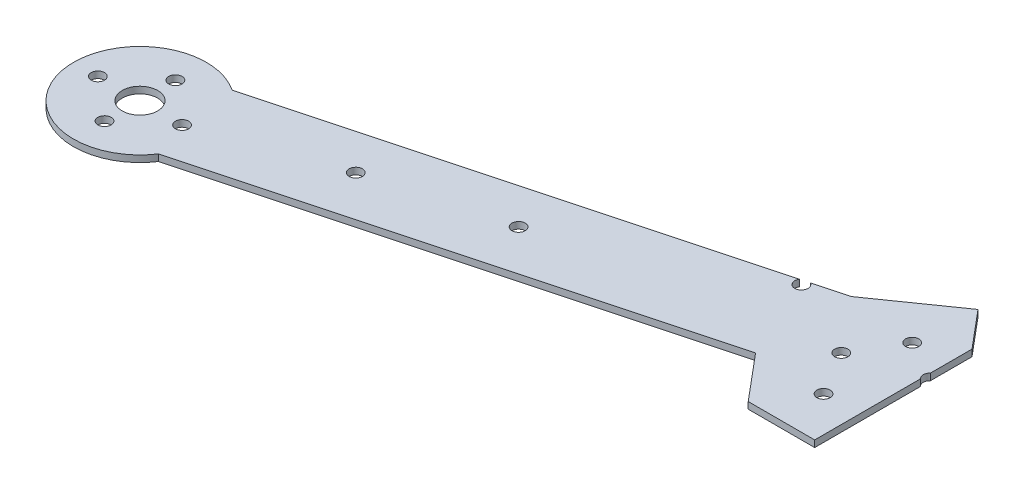
ISO-10303-21;
HEADER;
FILE_DESCRIPTION(('STEP AP214'),'2;1');
FILE_NAME('part.step','',(''),(''),'','','');
FILE_SCHEMA(('AUTOMOTIVE_DESIGN { 1 0 10303 214 1 1 1 1 }'));
ENDSEC;
DATA;
#1=APPLICATION_CONTEXT('core data for automotive mechanical design processes');
#2=APPLICATION_PROTOCOL_DEFINITION('international standard','automotive_design',2000,#1);
#3=PRODUCT_CONTEXT('',#1,'mechanical');
#4=PRODUCT('Part','Part','',(#3));
#5=PRODUCT_RELATED_PRODUCT_CATEGORY('part','',(#4));
#6=PRODUCT_DEFINITION_FORMATION('','',#4);
#7=PRODUCT_DEFINITION_CONTEXT('part definition',#1,'design');
#8=PRODUCT_DEFINITION('design','',#6,#7);
#9=PRODUCT_DEFINITION_SHAPE('','',#8);
#10=(LENGTH_UNIT() NAMED_UNIT(*) SI_UNIT(.MILLI.,.METRE.));
#11=(NAMED_UNIT(*) PLANE_ANGLE_UNIT() SI_UNIT($,.RADIAN.));
#12=(NAMED_UNIT(*) SI_UNIT($,.STERADIAN.) SOLID_ANGLE_UNIT());
#13=UNCERTAINTY_MEASURE_WITH_UNIT(LENGTH_MEASURE(1.E-05),#10,'distance_accuracy_value','');
#14=(GEOMETRIC_REPRESENTATION_CONTEXT(3) GLOBAL_UNCERTAINTY_ASSIGNED_CONTEXT((#13)) GLOBAL_UNIT_ASSIGNED_CONTEXT((#10,
#11,#12)) REPRESENTATION_CONTEXT('',''));
#15=CARTESIAN_POINT('',(0.,0.,0.));
#16=DIRECTION('',(0.,0.,1.));
#17=DIRECTION('',(1.,0.,0.));
#18=AXIS2_PLACEMENT_3D('',#15,#16,#17);
#19=CARTESIAN_POINT('',(8.04869789920337,1.5,30.0437649531862));
#20=DIRECTION('',(0.258773909128812,0.,0.965937919306512));
#21=DIRECTION('',(0.965937919306512,0.,-0.258773909128812));
#22=AXIS2_PLACEMENT_3D('',#19,#20,#21);
#23=PLANE('',#22);
#24=DIRECTION('',(-0.965937919306512,0.,0.258773909128812));
#25=VECTOR('',#24,1.);
#26=CARTESIAN_POINT('',(8.04869789920337,0.,30.0437649531862));
#27=LINE('',#26,#25);
#28=CARTESIAN_POINT('',(-23.8632806144762,0.,38.5929556029831));
#29=VERTEX_POINT('',#28);
#30=CARTESIAN_POINT('',(-31.1943125351646,0.,40.5569325316729));
#31=VERTEX_POINT('',#30);
#32=EDGE_CURVE('E215',#29,#31,#27,.T.);
#33=ORIENTED_EDGE('',*,*,#32,.T.);
#34=DIRECTION('',(0.,1.,0.));
#35=VECTOR('',#34,1.);
#36=CARTESIAN_POINT('',(-31.1943125351646,-4.24264068711929,40.5569325316729));
#37=LINE('',#36,#35);
#38=CARTESIAN_POINT('',(-31.1943125351646,1.5,40.5569325316729));
#39=VERTEX_POINT('',#38);
#40=EDGE_CURVE('E59',#31,#39,#37,.T.);
#41=ORIENTED_EDGE('',*,*,#40,.T.);
#42=DIRECTION('',(-0.965937919306512,0.,0.258773909128812));
#43=VECTOR('',#42,1.);
#44=CARTESIAN_POINT('',(8.04869789920337,1.5,30.0437649531862));
#45=LINE('',#44,#43);
#46=CARTESIAN_POINT('',(-23.8632806144762,1.5,38.5929556029831));
#47=VERTEX_POINT('',#46);
#48=EDGE_CURVE('E310',#47,#39,#45,.T.);
#49=ORIENTED_EDGE('',*,*,#48,.F.);
#50=DIRECTION('',(0.,-1.,0.));
#51=VECTOR('',#50,1.);
#52=CARTESIAN_POINT('',(-23.8632806144762,1.5,38.5929556029831));
#53=LINE('',#52,#51);
#54=EDGE_CURVE('E266',#47,#29,#53,.T.);
#55=ORIENTED_EDGE('',*,*,#54,.T.);
#56=EDGE_LOOP('',(#33,#41,#49,#55));
#57=FACE_BOUND('',#56,.T.);
#58=ADVANCED_FACE('F43',(#57),#23,.F.);
#59=CARTESIAN_POINT('',(0.999999999999998,1.5,45.7611275320955));
#60=DIRECTION('',(0.,-1.,0.));
#61=DIRECTION('',(0.,0.,-1.));
#62=AXIS2_PLACEMENT_3D('',#59,#60,#61);
#63=CYLINDRICAL_SURFACE('',#62,1.5);
#64=CARTESIAN_POINT('',(0.999999999999998,0.,45.7611275320955));
#65=DIRECTION('',(0.,1.,0.));
#66=DIRECTION('',(0.,0.,1.));
#67=AXIS2_PLACEMENT_3D('',#64,#65,#66);
#68=CIRCLE('',#67,1.5);
#69=CARTESIAN_POINT('',(0.,0.,44.6430935433456));
#70=VERTEX_POINT('',#69);
#71=CARTESIAN_POINT('',(0.,0.,46.8791615208454));
#72=VERTEX_POINT('',#71);
#73=EDGE_CURVE('E199',#70,#72,#68,.T.);
#74=ORIENTED_EDGE('',*,*,#73,.F.);
#75=DIRECTION('',(0.,-1.,0.));
#76=VECTOR('',#75,1.);
#77=CARTESIAN_POINT('',(0.,1.5,44.6430935433456));
#78=LINE('',#77,#76);
#79=CARTESIAN_POINT('',(0.,1.5,44.6430935433456));
#80=VERTEX_POINT('',#79);
#81=EDGE_CURVE('E52',#80,#70,#78,.T.);
#82=ORIENTED_EDGE('',*,*,#81,.F.);
#83=CARTESIAN_POINT('',(0.999999999999998,1.5,45.7611275320955));
#84=DIRECTION('',(0.,1.,0.));
#85=DIRECTION('',(0.,0.,1.));
#86=AXIS2_PLACEMENT_3D('',#83,#84,#85);
#87=CIRCLE('',#86,1.5);
#88=CARTESIAN_POINT('',(0.,1.5,46.8791615208454));
#89=VERTEX_POINT('',#88);
#90=EDGE_CURVE('E299',#80,#89,#87,.T.);
#91=ORIENTED_EDGE('',*,*,#90,.T.);
#92=DIRECTION('',(0.,-1.,0.));
#93=VECTOR('',#92,1.);
#94=CARTESIAN_POINT('',(0.,1.5,46.8791615208454));
#95=LINE('',#94,#93);
#96=EDGE_CURVE('E67',#89,#72,#95,.T.);
#97=ORIENTED_EDGE('',*,*,#96,.T.);
#98=EDGE_LOOP('',(#74,#82,#91,#97));
#99=FACE_BOUND('',#98,.T.);
#100=ADVANCED_FACE('F283',(#99),#63,.F.);
#101=CARTESIAN_POINT('',(0.,1.5,0.));
#102=DIRECTION('',(1.,0.,0.));
#103=DIRECTION('',(0.,0.,-1.));
#104=AXIS2_PLACEMENT_3D('',#101,#102,#103);
#105=PLANE('',#104);
#106=DIRECTION('',(0.,0.,1.));
#107=VECTOR('',#106,1.);
#108=CARTESIAN_POINT('',(0.,0.,0.));
#109=LINE('',#108,#107);
#110=CARTESIAN_POINT('',(0.,0.,35.2611275320955));
#111=VERTEX_POINT('',#110);
#112=EDGE_CURVE('E202',#111,#70,#109,.T.);
#113=ORIENTED_EDGE('',*,*,#112,.F.);
#114=DIRECTION('',(0.,-1.,0.));
#115=VECTOR('',#114,1.);
#116=CARTESIAN_POINT('',(0.,1.5,35.2611275320955));
#117=LINE('',#116,#115);
#118=CARTESIAN_POINT('',(0.,1.5,35.2611275320955));
#119=VERTEX_POINT('',#118);
#120=EDGE_CURVE('E274',#119,#111,#117,.T.);
#121=ORIENTED_EDGE('',*,*,#120,.F.);
#122=DIRECTION('',(0.,0.,1.));
#123=VECTOR('',#122,1.);
#124=CARTESIAN_POINT('',(0.,1.5,0.));
#125=LINE('',#124,#123);
#126=EDGE_CURVE('E282',#119,#80,#125,.T.);
#127=ORIENTED_EDGE('',*,*,#126,.T.);
#128=ORIENTED_EDGE('',*,*,#81,.T.);
#129=EDGE_LOOP('',(#113,#121,#127,#128));
#130=FACE_BOUND('',#129,.T.);
#131=ADVANCED_FACE('F280',(#130),#105,.T.);
#132=CARTESIAN_POINT('',(-17.3627158867799,1.5,14.5690484968327));
#133=DIRECTION('',(-0.766044443118982,0.,0.642787609686535));
#134=DIRECTION('',(0.642787609686535,0.,0.766044443118982));
#135=AXIS2_PLACEMENT_3D('',#132,#133,#134);
#136=PLANE('',#135);
#137=DIRECTION('',(-0.642787609686535,0.,-0.766044443118982));
#138=VECTOR('',#137,1.);
#139=CARTESIAN_POINT('',(-17.3627158867799,0.,14.5690484968327));
#140=LINE('',#139,#138);
#141=CARTESIAN_POINT('',(-7.07066370655188,0.,26.8346386577867));
#142=VERTEX_POINT('',#141);
#143=EDGE_CURVE('E206',#111,#142,#140,.T.);
#144=ORIENTED_EDGE('',*,*,#143,.T.);
#145=DIRECTION('',(0.,-1.,0.));
#146=VECTOR('',#145,1.);
#147=CARTESIAN_POINT('',(-7.07066370655188,1.5,26.8346386577867));
#148=LINE('',#147,#146);
#149=CARTESIAN_POINT('',(-7.07066370655188,1.5,26.8346386577867));
#150=VERTEX_POINT('',#149);
#151=EDGE_CURVE('E270',#150,#142,#148,.T.);
#152=ORIENTED_EDGE('',*,*,#151,.F.);
#153=DIRECTION('',(-0.642787609686535,0.,-0.766044443118982));
#154=VECTOR('',#153,1.);
#155=CARTESIAN_POINT('',(-17.3627158867799,1.5,14.5690484968327));
#156=LINE('',#155,#154);
#157=EDGE_CURVE('E294',#119,#150,#156,.T.);
#158=ORIENTED_EDGE('',*,*,#157,.F.);
#159=ORIENTED_EDGE('',*,*,#120,.T.);
#160=EDGE_LOOP('',(#144,#152,#158,#159));
#161=FACE_BOUND('',#160,.T.);
#162=ADVANCED_FACE('F291',(#161),#136,.F.);
#163=CARTESIAN_POINT('',(10.2819788179745,1.5,14.684187554255));
#164=DIRECTION('',(0.573576436351045,0.,0.819152044288993));
#165=DIRECTION('',(0.819152044288993,0.,-0.573576436351045));
#166=AXIS2_PLACEMENT_3D('',#163,#164,#165);
#167=PLANE('',#166);
#168=DIRECTION('',(-0.819152044288993,0.,0.573576436351045));
#169=VECTOR('',#168,1.);
#170=CARTESIAN_POINT('',(10.2819788179745,0.,14.684187554255));
#171=LINE('',#170,#169);
#172=EDGE_CURVE('E210',#142,#29,#171,.T.);
#173=ORIENTED_EDGE('',*,*,#172,.T.);
#174=ORIENTED_EDGE('',*,*,#54,.F.);
#175=DIRECTION('',(-0.819152044288993,0.,0.573576436351045));
#176=VECTOR('',#175,1.);
#177=CARTESIAN_POINT('',(10.2819788179745,1.5,14.684187554255));
#178=LINE('',#177,#176);
#179=EDGE_CURVE('E297',#150,#47,#178,.T.);
#180=ORIENTED_EDGE('',*,*,#179,.F.);
#181=ORIENTED_EDGE('',*,*,#151,.T.);
#182=EDGE_LOOP('',(#173,#174,#180,#181));
#183=FACE_BOUND('',#182,.T.);
#184=ADVANCED_FACE('F350',(#183),#167,.F.);
#185=CARTESIAN_POINT('',(-33.1085220639019,1.5,41.0697475612336));
#186=VERTEX_POINT('',#185);
#187=CARTESIAN_POINT('',(-134.097880355283,1.5,68.1247067911532));
#188=VERTEX_POINT('',#187);
#189=EDGE_CURVE('E309',#186,#188,#45,.T.);
#190=ORIENTED_EDGE('',*,*,#189,.F.);
#191=DIRECTION('',(0.,1.,0.));
#192=VECTOR('',#191,1.);
#193=CARTESIAN_POINT('',(-33.1085220639019,-4.24264068711929,41.0697475612336));
#194=LINE('',#193,#192);
#195=CARTESIAN_POINT('',(-33.1085220639019,0.,41.0697475612336));
#196=VERTEX_POINT('',#195);
#197=EDGE_CURVE('E363',#186,#196,#194,.F.);
#198=ORIENTED_EDGE('',*,*,#197,.T.);
#199=CARTESIAN_POINT('',(-134.097880355283,0.,68.1247067911532));
#200=VERTEX_POINT('',#199);
#201=EDGE_CURVE('E214',#196,#200,#27,.T.);
#202=ORIENTED_EDGE('',*,*,#201,.T.);
#203=DIRECTION('',(0.,-1.,0.));
#204=VECTOR('',#203,1.);
#205=CARTESIAN_POINT('',(-134.097880355283,1.5,68.1247067911532));
#206=LINE('',#205,#204);
#207=EDGE_CURVE('E262',#188,#200,#206,.T.);
#208=ORIENTED_EDGE('',*,*,#207,.F.);
#209=EDGE_LOOP('',(#190,#198,#202,#208));
#210=FACE_BOUND('',#209,.T.);
#211=ADVANCED_FACE('F341',(#210),#23,.F.);
#212=CARTESIAN_POINT('',(-142.429473622566,1.5,80.5980605353781));
#213=DIRECTION('',(0.,-1.,0.));
#214=DIRECTION('',(0.,0.,-1.));
#215=AXIS2_PLACEMENT_3D('',#212,#213,#214);
#216=CYLINDRICAL_SURFACE('',#215,15.);
#217=CARTESIAN_POINT('',(-142.429473622566,0.,80.5980605353781));
#218=DIRECTION('',(0.,1.,0.));
#219=DIRECTION('',(0.,0.,1.));
#220=AXIS2_PLACEMENT_3D('',#217,#218,#219);
#221=CIRCLE('',#220,15.);
#222=CARTESIAN_POINT('',(-129.929473622566,0.,88.8896225112666));
#223=VERTEX_POINT('',#222);
#224=EDGE_CURVE('E219',#200,#223,#221,.T.);
#225=ORIENTED_EDGE('',*,*,#224,.T.);
#226=DIRECTION('',(0.,-1.,0.));
#227=VECTOR('',#226,1.);
#228=CARTESIAN_POINT('',(-129.929473622566,1.5,88.8896225112666));
#229=LINE('',#228,#227);
#230=CARTESIAN_POINT('',(-129.929473622566,1.5,88.8896225112666));
#231=VERTEX_POINT('',#230);
#232=EDGE_CURVE('E259',#231,#223,#229,.T.);
#233=ORIENTED_EDGE('',*,*,#232,.F.);
#234=CARTESIAN_POINT('',(-142.429473622566,1.5,80.5980605353781));
#235=DIRECTION('',(0.,1.,0.));
#236=DIRECTION('',(0.,0.,1.));
#237=AXIS2_PLACEMENT_3D('',#234,#235,#236);
#238=CIRCLE('',#237,15.);
#239=EDGE_CURVE('E314',#188,#231,#238,.T.);
#240=ORIENTED_EDGE('',*,*,#239,.F.);
#241=ORIENTED_EDGE('',*,*,#207,.T.);
#242=EDGE_LOOP('',(#225,#233,#240,#241));
#243=FACE_BOUND('',#242,.T.);
#244=ADVANCED_FACE('F349',(#243),#216,.T.);
#245=CARTESIAN_POINT('',(13.5187812452748,1.5,50.4527784637748));
#246=DIRECTION('',(0.258819045102521,0.,0.965925826289068));
#247=DIRECTION('',(0.965925826289068,0.,-0.258819045102521));
#248=AXIS2_PLACEMENT_3D('',#245,#246,#247);
#249=PLANE('',#248);
#250=DIRECTION('',(-0.965925826289068,0.,0.258819045102521));
#251=VECTOR('',#250,1.);
#252=CARTESIAN_POINT('',(13.5187812452748,0.,50.4527784637748));
#253=LINE('',#252,#251);
#254=CARTESIAN_POINT('',(-23.6776327307683,0.,60.4195275499893));
#255=VERTEX_POINT('',#254);
#256=EDGE_CURVE('E223',#255,#223,#253,.T.);
#257=ORIENTED_EDGE('',*,*,#256,.F.);
#258=DIRECTION('',(0.,-1.,0.));
#259=VECTOR('',#258,1.);
#260=CARTESIAN_POINT('',(-23.6776327307683,1.5,60.4195275499893));
#261=LINE('',#260,#259);
#262=CARTESIAN_POINT('',(-23.6776327307683,1.5,60.4195275499893));
#263=VERTEX_POINT('',#262);
#264=EDGE_CURVE('E144',#263,#255,#261,.T.);
#265=ORIENTED_EDGE('',*,*,#264,.F.);
#266=DIRECTION('',(-0.965925826289068,0.,0.258819045102521));
#267=VECTOR('',#266,1.);
#268=CARTESIAN_POINT('',(13.5187812452748,1.5,50.4527784637748));
#269=LINE('',#268,#267);
#270=EDGE_CURVE('E156',#263,#231,#269,.T.);
#271=ORIENTED_EDGE('',*,*,#270,.T.);
#272=ORIENTED_EDGE('',*,*,#232,.T.);
#273=EDGE_LOOP('',(#257,#265,#271,#272));
#274=FACE_BOUND('',#273,.T.);
#275=ADVANCED_FACE('F319',(#274),#249,.T.);
#276=CARTESIAN_POINT('',(-43.6454148352486,1.5,36.6228514908364));
#277=DIRECTION('',(-0.766044443118979,0.,0.642787609686538));
#278=DIRECTION('',(0.642787609686538,0.,0.766044443118979));
#279=AXIS2_PLACEMENT_3D('',#276,#277,#278);
#280=PLANE('',#279);
#281=DIRECTION('',(-0.642787609686538,0.,-0.766044443118979));
#282=VECTOR('',#281,1.);
#283=CARTESIAN_POINT('',(-43.6454148352486,0.,36.6228514908364));
#284=LINE('',#283,#282);
#285=CARTESIAN_POINT('',(-15.,0.,70.7611275320955));
#286=VERTEX_POINT('',#285);
#287=EDGE_CURVE('E138',#286,#255,#284,.T.);
#288=ORIENTED_EDGE('',*,*,#287,.F.);
#289=DIRECTION('',(0.,-1.,0.));
#290=VECTOR('',#289,1.);
#291=CARTESIAN_POINT('',(-15.,1.5,70.7611275320955));
#292=LINE('',#291,#290);
#293=CARTESIAN_POINT('',(-15.,1.5,70.7611275320955));
#294=VERTEX_POINT('',#293);
#295=EDGE_CURVE('E133',#294,#286,#292,.T.);
#296=ORIENTED_EDGE('',*,*,#295,.F.);
#297=DIRECTION('',(-0.642787609686538,0.,-0.766044443118979));
#298=VECTOR('',#297,1.);
#299=CARTESIAN_POINT('',(-43.6454148352486,1.5,36.6228514908364));
#300=LINE('',#299,#298);
#301=EDGE_CURVE('E136',#294,#263,#300,.T.);
#302=ORIENTED_EDGE('',*,*,#301,.T.);
#303=ORIENTED_EDGE('',*,*,#264,.T.);
#304=EDGE_LOOP('',(#288,#296,#302,#303));
#305=FACE_BOUND('',#304,.T.);
#306=ADVANCED_FACE('F135',(#305),#280,.T.);
#307=CARTESIAN_POINT('',(0.,1.5,70.7611275320955));
#308=DIRECTION('',(0.,0.,1.));
#309=DIRECTION('',(1.,0.,0.));
#310=AXIS2_PLACEMENT_3D('',#307,#308,#309);
#311=PLANE('',#310);
#312=DIRECTION('',(-1.,0.,0.));
#313=VECTOR('',#312,1.);
#314=CARTESIAN_POINT('',(0.,0.,70.7611275320955));
#315=LINE('',#314,#313);
#316=CARTESIAN_POINT('',(0.,0.,70.7611275320955));
#317=VERTEX_POINT('',#316);
#318=EDGE_CURVE('E229',#317,#286,#315,.T.);
#319=ORIENTED_EDGE('',*,*,#318,.F.);
#320=DIRECTION('',(0.,-1.,0.));
#321=VECTOR('',#320,1.);
#322=CARTESIAN_POINT('',(0.,1.5,70.7611275320955));
#323=LINE('',#322,#321);
#324=CARTESIAN_POINT('',(0.,1.5,70.7611275320955));
#325=VERTEX_POINT('',#324);
#326=EDGE_CURVE('E145',#325,#317,#323,.T.);
#327=ORIENTED_EDGE('',*,*,#326,.F.);
#328=DIRECTION('',(-1.,0.,0.));
#329=VECTOR('',#328,1.);
#330=CARTESIAN_POINT('',(0.,1.5,70.7611275320955));
#331=LINE('',#330,#329);
#332=EDGE_CURVE('E154',#325,#294,#331,.T.);
#333=ORIENTED_EDGE('',*,*,#332,.T.);
#334=ORIENTED_EDGE('',*,*,#295,.T.);
#335=EDGE_LOOP('',(#319,#327,#333,#334));
#336=FACE_BOUND('',#335,.T.);
#337=ADVANCED_FACE('F159',(#336),#311,.T.);
#338=CARTESIAN_POINT('',(-8.,1.5,60.7611275320955));
#339=DIRECTION('',(0.,-1.,0.));
#340=DIRECTION('',(0.,0.,-1.));
#341=AXIS2_PLACEMENT_3D('',#338,#339,#340);
#342=CYLINDRICAL_SURFACE('',#341,1.5);
#343=CARTESIAN_POINT('',(-8.,1.5,60.7611275320955));
#344=DIRECTION('',(0.,1.,0.));
#345=DIRECTION('',(0.,0.,1.));
#346=AXIS2_PLACEMENT_3D('',#343,#344,#345);
#347=CIRCLE('',#346,1.5);
#348=CARTESIAN_POINT('',(-8.,1.5,62.2611275320955));
#349=VERTEX_POINT('',#348);
#350=EDGE_CURVE('E175',#349,#349,#347,.T.);
#351=ORIENTED_EDGE('',*,*,#350,.T.);
#352=EDGE_LOOP('',(#351));
#353=FACE_BOUND('',#352,.T.);
#354=CARTESIAN_POINT('',(-8.,0.,60.7611275320955));
#355=DIRECTION('',(0.,1.,0.));
#356=DIRECTION('',(0.,0.,1.));
#357=AXIS2_PLACEMENT_3D('',#354,#355,#356);
#358=CIRCLE('',#357,1.5);
#359=CARTESIAN_POINT('',(-8.,0.,62.2611275320955));
#360=VERTEX_POINT('',#359);
#361=EDGE_CURVE('E244',#360,#360,#358,.T.);
#362=ORIENTED_EDGE('',*,*,#361,.F.);
#363=EDGE_LOOP('',(#362));
#364=FACE_BOUND('',#363,.T.);
#365=ADVANCED_FACE('F440',(#353,#364),#342,.F.);
#366=CARTESIAN_POINT('',(-14.,1.5,50.7611275320955));
#367=DIRECTION('',(0.,-1.,0.));
#368=DIRECTION('',(0.,0.,-1.));
#369=AXIS2_PLACEMENT_3D('',#366,#367,#368);
#370=CYLINDRICAL_SURFACE('',#369,1.5);
#371=CARTESIAN_POINT('',(-14.,1.5,50.7611275320955));
#372=DIRECTION('',(0.,1.,0.));
#373=DIRECTION('',(0.,0.,1.));
#374=AXIS2_PLACEMENT_3D('',#371,#372,#373);
#375=CIRCLE('',#374,1.5);
#376=CARTESIAN_POINT('',(-14.,1.5,52.2611275320955));
#377=VERTEX_POINT('',#376);
#378=EDGE_CURVE('E171',#377,#377,#375,.T.);
#379=ORIENTED_EDGE('',*,*,#378,.T.);
#380=EDGE_LOOP('',(#379));
#381=FACE_BOUND('',#380,.T.);
#382=CARTESIAN_POINT('',(-14.,0.,50.7611275320955));
#383=DIRECTION('',(0.,1.,0.));
#384=DIRECTION('',(0.,0.,1.));
#385=AXIS2_PLACEMENT_3D('',#382,#383,#384);
#386=CIRCLE('',#385,1.5);
#387=CARTESIAN_POINT('',(-14.,0.,52.2611275320955));
#388=VERTEX_POINT('',#387);
#389=EDGE_CURVE('E240',#388,#388,#386,.T.);
#390=ORIENTED_EDGE('',*,*,#389,.F.);
#391=EDGE_LOOP('',(#390));
#392=FACE_BOUND('',#391,.T.);
#393=ADVANCED_FACE('F334',(#381,#392),#370,.F.);
#394=CARTESIAN_POINT('',(-8.,1.5,40.7611275320955));
#395=DIRECTION('',(0.,-1.,0.));
#396=DIRECTION('',(0.,0.,-1.));
#397=AXIS2_PLACEMENT_3D('',#394,#395,#396);
#398=CYLINDRICAL_SURFACE('',#397,1.5);
#399=CARTESIAN_POINT('',(-8.,1.5,40.7611275320955));
#400=DIRECTION('',(0.,1.,0.));
#401=DIRECTION('',(0.,0.,1.));
#402=AXIS2_PLACEMENT_3D('',#399,#400,#401);
#403=CIRCLE('',#402,1.5);
#404=CARTESIAN_POINT('',(-8.,1.5,42.2611275320955));
#405=VERTEX_POINT('',#404);
#406=EDGE_CURVE('E164',#405,#405,#403,.T.);
#407=ORIENTED_EDGE('',*,*,#406,.T.);
#408=EDGE_LOOP('',(#407));
#409=FACE_BOUND('',#408,.T.);
#410=CARTESIAN_POINT('',(-8.,0.,40.7611275320955));
#411=DIRECTION('',(0.,1.,0.));
#412=DIRECTION('',(0.,0.,1.));
#413=AXIS2_PLACEMENT_3D('',#410,#411,#412);
#414=CIRCLE('',#413,1.5);
#415=CARTESIAN_POINT('',(-8.,0.,42.2611275320955));
#416=VERTEX_POINT('',#415);
#417=EDGE_CURVE('E236',#416,#416,#414,.T.);
#418=ORIENTED_EDGE('',*,*,#417,.F.);
#419=EDGE_LOOP('',(#418));
#420=FACE_BOUND('',#419,.T.);
#421=ADVANCED_FACE('F325',(#409,#420),#398,.F.);
#422=CARTESIAN_POINT('',(0.,1.5,0.));
#423=DIRECTION('',(1.,0.,0.));
#424=DIRECTION('',(0.,0.,-1.));
#425=AXIS2_PLACEMENT_3D('',#422,#423,#424);
#426=PLANE('',#425);
#427=DIRECTION('',(0.,0.,1.));
#428=VECTOR('',#427,1.);
#429=CARTESIAN_POINT('',(0.,0.,0.));
#430=LINE('',#429,#428);
#431=EDGE_CURVE('E232',#72,#317,#430,.T.);
#432=ORIENTED_EDGE('',*,*,#431,.F.);
#433=ORIENTED_EDGE('',*,*,#96,.F.);
#434=DIRECTION('',(0.,0.,1.));
#435=VECTOR('',#434,1.);
#436=CARTESIAN_POINT('',(0.,1.5,0.));
#437=LINE('',#436,#435);
#438=EDGE_CURVE('E161',#89,#325,#437,.T.);
#439=ORIENTED_EDGE('',*,*,#438,.T.);
#440=ORIENTED_EDGE('',*,*,#326,.T.);
#441=EDGE_LOOP('',(#432,#433,#439,#440));
#442=FACE_BOUND('',#441,.T.);
#443=ADVANCED_FACE('F322',(#442),#426,.T.);
#444=CARTESIAN_POINT('',(-142.429473622566,1.5,72.5980605353781));
#445=DIRECTION('',(0.,-1.,0.));
#446=DIRECTION('',(0.,0.,-1.));
#447=AXIS2_PLACEMENT_3D('',#444,#445,#446);
#448=CYLINDRICAL_SURFACE('',#447,1.5);
#449=CARTESIAN_POINT('',(-142.429473622566,1.5,72.5980605353781));
#450=DIRECTION('',(0.,1.,0.));
#451=DIRECTION('',(0.,0.,1.));
#452=AXIS2_PLACEMENT_3D('',#449,#450,#451);
#453=CIRCLE('',#452,1.5);
#454=CARTESIAN_POINT('',(-142.429473622566,1.5,74.0980605353781));
#455=VERTEX_POINT('',#454);
#456=EDGE_CURVE('E303',#455,#455,#453,.T.);
#457=ORIENTED_EDGE('',*,*,#456,.T.);
#458=EDGE_LOOP('',(#457));
#459=FACE_BOUND('',#458,.T.);
#460=CARTESIAN_POINT('',(-142.429473622566,0.,72.5980605353781));
#461=DIRECTION('',(0.,1.,0.));
#462=DIRECTION('',(0.,0.,1.));
#463=AXIS2_PLACEMENT_3D('',#460,#461,#462);
#464=CIRCLE('',#463,1.5);
#465=CARTESIAN_POINT('',(-142.429473622566,0.,74.0980605353781));
#466=VERTEX_POINT('',#465);
#467=EDGE_CURVE('E195',#466,#466,#464,.T.);
#468=ORIENTED_EDGE('',*,*,#467,.F.);
#469=EDGE_LOOP('',(#468));
#470=FACE_BOUND('',#469,.T.);
#471=ADVANCED_FACE('F324',(#459,#470),#448,.F.);
#472=CARTESIAN_POINT('',(-132.929473622566,1.5,80.5980605353781));
#473=DIRECTION('',(0.,-1.,0.));
#474=DIRECTION('',(0.,0.,-1.));
#475=AXIS2_PLACEMENT_3D('',#472,#473,#474);
#476=CYLINDRICAL_SURFACE('',#475,1.5);
#477=CARTESIAN_POINT('',(-132.929473622566,1.5,80.5980605353781));
#478=DIRECTION('',(0.,1.,0.));
#479=DIRECTION('',(0.,0.,1.));
#480=AXIS2_PLACEMENT_3D('',#477,#478,#479);
#481=CIRCLE('',#480,1.5);
#482=CARTESIAN_POINT('',(-132.929473622566,1.5,82.0980605353781));
#483=VERTEX_POINT('',#482);
#484=EDGE_CURVE('E402',#483,#483,#481,.T.);
#485=ORIENTED_EDGE('',*,*,#484,.T.);
#486=EDGE_LOOP('',(#485));
#487=FACE_BOUND('',#486,.T.);
#488=CARTESIAN_POINT('',(-132.929473622566,0.,80.5980605353781));
#489=DIRECTION('',(0.,1.,0.));
#490=DIRECTION('',(0.,0.,1.));
#491=AXIS2_PLACEMENT_3D('',#488,#489,#490);
#492=CIRCLE('',#491,1.5);
#493=CARTESIAN_POINT('',(-132.929473622566,0.,82.0980605353781));
#494=VERTEX_POINT('',#493);
#495=EDGE_CURVE('E191',#494,#494,#492,.T.);
#496=ORIENTED_EDGE('',*,*,#495,.F.);
#497=EDGE_LOOP('',(#496));
#498=FACE_BOUND('',#497,.T.);
#499=ADVANCED_FACE('F331',(#487,#498),#476,.F.);
#500=CARTESIAN_POINT('',(-151.929473622566,1.5,80.5980605353781));
#501=DIRECTION('',(0.,-1.,0.));
#502=DIRECTION('',(0.,0.,-1.));
#503=AXIS2_PLACEMENT_3D('',#500,#501,#502);
#504=CYLINDRICAL_SURFACE('',#503,1.5);
#505=CARTESIAN_POINT('',(-151.929473622566,1.5,80.5980605353781));
#506=DIRECTION('',(0.,1.,0.));
#507=DIRECTION('',(0.,0.,1.));
#508=AXIS2_PLACEMENT_3D('',#505,#506,#507);
#509=CIRCLE('',#508,1.5);
#510=CARTESIAN_POINT('',(-151.929473622566,1.5,82.0980605353781));
#511=VERTEX_POINT('',#510);
#512=EDGE_CURVE('E398',#511,#511,#509,.T.);
#513=ORIENTED_EDGE('',*,*,#512,.T.);
#514=EDGE_LOOP('',(#513));
#515=FACE_BOUND('',#514,.T.);
#516=CARTESIAN_POINT('',(-151.929473622566,0.,80.5980605353781));
#517=DIRECTION('',(0.,1.,0.));
#518=DIRECTION('',(0.,0.,1.));
#519=AXIS2_PLACEMENT_3D('',#516,#517,#518);
#520=CIRCLE('',#519,1.5);
#521=CARTESIAN_POINT('',(-151.929473622566,0.,82.0980605353781));
#522=VERTEX_POINT('',#521);
#523=EDGE_CURVE('E187',#522,#522,#520,.T.);
#524=ORIENTED_EDGE('',*,*,#523,.F.);
#525=EDGE_LOOP('',(#524));
#526=FACE_BOUND('',#525,.T.);
#527=ADVANCED_FACE('F480',(#515,#526),#504,.F.);
#528=CARTESIAN_POINT('',(-142.429473622566,1.5,88.5980605353781));
#529=DIRECTION('',(0.,-1.,0.));
#530=DIRECTION('',(0.,0.,-1.));
#531=AXIS2_PLACEMENT_3D('',#528,#529,#530);
#532=CYLINDRICAL_SURFACE('',#531,1.5);
#533=CARTESIAN_POINT('',(-142.429473622566,1.5,88.5980605353781));
#534=DIRECTION('',(0.,1.,0.));
#535=DIRECTION('',(0.,0.,1.));
#536=AXIS2_PLACEMENT_3D('',#533,#534,#535);
#537=CIRCLE('',#536,1.5);
#538=CARTESIAN_POINT('',(-142.429473622566,1.5,90.0980605353781));
#539=VERTEX_POINT('',#538);
#540=EDGE_CURVE('E252',#539,#539,#537,.T.);
#541=ORIENTED_EDGE('',*,*,#540,.T.);
#542=EDGE_LOOP('',(#541));
#543=FACE_BOUND('',#542,.T.);
#544=CARTESIAN_POINT('',(-142.429473622566,0.,88.5980605353781));
#545=DIRECTION('',(0.,1.,0.));
#546=DIRECTION('',(0.,0.,1.));
#547=AXIS2_PLACEMENT_3D('',#544,#545,#546);
#548=CIRCLE('',#547,1.5);
#549=CARTESIAN_POINT('',(-142.429473622566,0.,90.0980605353781));
#550=VERTEX_POINT('',#549);
#551=EDGE_CURVE('E183',#550,#550,#548,.T.);
#552=ORIENTED_EDGE('',*,*,#551,.F.);
#553=EDGE_LOOP('',(#552));
#554=FACE_BOUND('',#553,.T.);
#555=ADVANCED_FACE('F45',(#543,#554),#532,.F.);
#556=CARTESIAN_POINT('',(-142.429473622566,1.5,80.5980605353781));
#557=DIRECTION('',(0.,-1.,0.));
#558=DIRECTION('',(0.,0.,-1.));
#559=AXIS2_PLACEMENT_3D('',#556,#557,#558);
#560=CYLINDRICAL_SURFACE('',#559,3.99999999999999);
#561=CARTESIAN_POINT('',(-142.429473622566,1.5,80.5980605353781));
#562=DIRECTION('',(0.,1.,0.));
#563=DIRECTION('',(0.,0.,1.));
#564=AXIS2_PLACEMENT_3D('',#561,#562,#563);
#565=CIRCLE('',#564,3.99999999999999);
#566=CARTESIAN_POINT('',(-142.429473622566,1.5,84.5980605353781));
#567=VERTEX_POINT('',#566);
#568=EDGE_CURVE('E179',#567,#567,#565,.T.);
#569=ORIENTED_EDGE('',*,*,#568,.T.);
#570=EDGE_LOOP('',(#569));
#571=FACE_BOUND('',#570,.T.);
#572=CARTESIAN_POINT('',(-142.429473622566,0.,80.5980605353781));
#573=DIRECTION('',(0.,1.,0.));
#574=DIRECTION('',(0.,0.,1.));
#575=AXIS2_PLACEMENT_3D('',#572,#573,#574);
#576=CIRCLE('',#575,3.99999999999999);
#577=CARTESIAN_POINT('',(-142.429473622566,0.,84.5980605353781));
#578=VERTEX_POINT('',#577);
#579=EDGE_CURVE('E248',#578,#578,#576,.T.);
#580=ORIENTED_EDGE('',*,*,#579,.F.);
#581=EDGE_LOOP('',(#580));
#582=FACE_BOUND('',#581,.T.);
#583=ADVANCED_FACE('F412',(#571,#582),#560,.F.);
#584=CARTESIAN_POINT('',(0.,1.5,0.));
#585=DIRECTION('',(0.,1.,0.));
#586=DIRECTION('',(0.,0.,1.));
#587=AXIS2_PLACEMENT_3D('',#584,#585,#586);
#588=PLANE('',#587);
#589=CARTESIAN_POINT('',(-104.014122571746,1.5,70.3066221693253));
#590=DIRECTION('',(0.,1.,0.));
#591=DIRECTION('',(0.,0.,1.));
#592=AXIS2_PLACEMENT_3D('',#589,#590,#591);
#593=CIRCLE('',#592,1.5);
#594=CARTESIAN_POINT('',(-104.014122571746,1.5,71.8066221693253));
#595=VERTEX_POINT('',#594);
#596=EDGE_CURVE('E380',#595,#595,#593,.T.);
#597=ORIENTED_EDGE('',*,*,#596,.F.);
#598=EDGE_LOOP('',(#597));
#599=FACE_BOUND('',#598,.T.);
#600=CARTESIAN_POINT('',(-75.0359849925505,1.5,62.5434048954609));
#601=DIRECTION('',(0.,1.,0.));
#602=DIRECTION('',(0.,0.,1.));
#603=AXIS2_PLACEMENT_3D('',#600,#601,#602);
#604=CIRCLE('',#603,1.5);
#605=CARTESIAN_POINT('',(-75.0359849925505,1.5,64.0434048954609));
#606=VERTEX_POINT('',#605);
#607=EDGE_CURVE('E388',#606,#606,#604,.T.);
#608=ORIENTED_EDGE('',*,*,#607,.F.);
#609=EDGE_LOOP('',(#608));
#610=FACE_BOUND('',#609,.T.);
#611=CARTESIAN_POINT('',(-31.86,1.5,41.9011275320955));
#612=DIRECTION('',(0.,1.,0.));
#613=DIRECTION('',(0.,0.,1.));
#614=AXIS2_PLACEMENT_3D('',#611,#612,#613);
#615=CIRCLE('',#614,1.5);
#616=EDGE_CURVE('E367',#186,#39,#615,.T.);
#617=ORIENTED_EDGE('',*,*,#616,.F.);
#618=ORIENTED_EDGE('',*,*,#189,.T.);
#619=ORIENTED_EDGE('',*,*,#239,.T.);
#620=ORIENTED_EDGE('',*,*,#270,.F.);
#621=ORIENTED_EDGE('',*,*,#301,.F.);
#622=ORIENTED_EDGE('',*,*,#332,.F.);
#623=ORIENTED_EDGE('',*,*,#438,.F.);
#624=ORIENTED_EDGE('',*,*,#90,.F.);
#625=ORIENTED_EDGE('',*,*,#126,.F.);
#626=ORIENTED_EDGE('',*,*,#157,.T.);
#627=ORIENTED_EDGE('',*,*,#179,.T.);
#628=ORIENTED_EDGE('',*,*,#48,.T.);
#629=EDGE_LOOP('',(#617,#618,#619,#620,#621,#622,#623,#624,#625,#626,#627,#628));
#630=FACE_BOUND('',#629,.T.);
#631=ORIENTED_EDGE('',*,*,#540,.F.);
#632=EDGE_LOOP('',(#631));
#633=FACE_BOUND('',#632,.T.);
#634=ORIENTED_EDGE('',*,*,#512,.F.);
#635=EDGE_LOOP('',(#634));
#636=FACE_BOUND('',#635,.T.);
#637=ORIENTED_EDGE('',*,*,#484,.F.);
#638=EDGE_LOOP('',(#637));
#639=FACE_BOUND('',#638,.T.);
#640=ORIENTED_EDGE('',*,*,#456,.F.);
#641=EDGE_LOOP('',(#640));
#642=FACE_BOUND('',#641,.T.);
#643=ORIENTED_EDGE('',*,*,#406,.F.);
#644=EDGE_LOOP('',(#643));
#645=FACE_BOUND('',#644,.T.);
#646=ORIENTED_EDGE('',*,*,#378,.F.);
#647=EDGE_LOOP('',(#646));
#648=FACE_BOUND('',#647,.T.);
#649=ORIENTED_EDGE('',*,*,#350,.F.);
#650=EDGE_LOOP('',(#649));
#651=FACE_BOUND('',#650,.T.);
#652=ORIENTED_EDGE('',*,*,#568,.F.);
#653=EDGE_LOOP('',(#652));
#654=FACE_BOUND('',#653,.T.);
#655=ADVANCED_FACE('F151',(#599,#610,#630,#633,#636,#639,#642,#645,#648,#651,#654),#588,.T.);
#656=CARTESIAN_POINT('',(0.,0.,0.));
#657=DIRECTION('',(0.,1.,0.));
#658=DIRECTION('',(0.,0.,1.));
#659=AXIS2_PLACEMENT_3D('',#656,#657,#658);
#660=PLANE('',#659);
#661=CARTESIAN_POINT('',(-104.014122571746,0.,70.3066221693253));
#662=DIRECTION('',(0.,1.,0.));
#663=DIRECTION('',(0.,0.,1.));
#664=AXIS2_PLACEMENT_3D('',#661,#662,#663);
#665=CIRCLE('',#664,1.5);
#666=CARTESIAN_POINT('',(-104.014122571746,0.,71.8066221693253));
#667=VERTEX_POINT('',#666);
#668=EDGE_CURVE('E376',#667,#667,#665,.F.);
#669=ORIENTED_EDGE('',*,*,#668,.F.);
#670=EDGE_LOOP('',(#669));
#671=FACE_BOUND('',#670,.T.);
#672=CARTESIAN_POINT('',(-75.0359849925505,0.,62.5434048954609));
#673=DIRECTION('',(0.,1.,0.));
#674=DIRECTION('',(0.,0.,1.));
#675=AXIS2_PLACEMENT_3D('',#672,#673,#674);
#676=CIRCLE('',#675,1.5);
#677=CARTESIAN_POINT('',(-75.0359849925505,0.,64.0434048954609));
#678=VERTEX_POINT('',#677);
#679=EDGE_CURVE('E384',#678,#678,#676,.F.);
#680=ORIENTED_EDGE('',*,*,#679,.F.);
#681=EDGE_LOOP('',(#680));
#682=FACE_BOUND('',#681,.T.);
#683=ORIENTED_EDGE('',*,*,#551,.T.);
#684=EDGE_LOOP('',(#683));
#685=FACE_BOUND('',#684,.T.);
#686=ORIENTED_EDGE('',*,*,#523,.T.);
#687=EDGE_LOOP('',(#686));
#688=FACE_BOUND('',#687,.T.);
#689=ORIENTED_EDGE('',*,*,#495,.T.);
#690=EDGE_LOOP('',(#689));
#691=FACE_BOUND('',#690,.T.);
#692=ORIENTED_EDGE('',*,*,#467,.T.);
#693=EDGE_LOOP('',(#692));
#694=FACE_BOUND('',#693,.T.);
#695=ORIENTED_EDGE('',*,*,#201,.F.);
#696=CARTESIAN_POINT('',(-31.86,0.,41.9011275320955));
#697=DIRECTION('',(0.,1.,0.));
#698=DIRECTION('',(0.,0.,1.));
#699=AXIS2_PLACEMENT_3D('',#696,#697,#698);
#700=CIRCLE('',#699,1.5);
#701=EDGE_CURVE('E11',#196,#31,#700,.T.);
#702=ORIENTED_EDGE('',*,*,#701,.T.);
#703=ORIENTED_EDGE('',*,*,#32,.F.);
#704=ORIENTED_EDGE('',*,*,#172,.F.);
#705=ORIENTED_EDGE('',*,*,#143,.F.);
#706=ORIENTED_EDGE('',*,*,#112,.T.);
#707=ORIENTED_EDGE('',*,*,#73,.T.);
#708=ORIENTED_EDGE('',*,*,#431,.T.);
#709=ORIENTED_EDGE('',*,*,#318,.T.);
#710=ORIENTED_EDGE('',*,*,#287,.T.);
#711=ORIENTED_EDGE('',*,*,#256,.T.);
#712=ORIENTED_EDGE('',*,*,#224,.F.);
#713=EDGE_LOOP('',(#695,#702,#703,#704,#705,#706,#707,#708,#709,#710,#711,#712));
#714=FACE_BOUND('',#713,.T.);
#715=ORIENTED_EDGE('',*,*,#417,.T.);
#716=EDGE_LOOP('',(#715));
#717=FACE_BOUND('',#716,.T.);
#718=ORIENTED_EDGE('',*,*,#389,.T.);
#719=EDGE_LOOP('',(#718));
#720=FACE_BOUND('',#719,.T.);
#721=ORIENTED_EDGE('',*,*,#361,.T.);
#722=EDGE_LOOP('',(#721));
#723=FACE_BOUND('',#722,.T.);
#724=ORIENTED_EDGE('',*,*,#579,.T.);
#725=EDGE_LOOP('',(#724));
#726=FACE_BOUND('',#725,.T.);
#727=ADVANCED_FACE('F287',(#671,#682,#685,#688,#691,#694,#714,#717,#720,#723,#726),#660,.F.);
#728=CARTESIAN_POINT('',(-31.86,-4.24264068711929,41.9011275320955));
#729=DIRECTION('',(0.,1.,0.));
#730=DIRECTION('',(0.,0.,1.));
#731=AXIS2_PLACEMENT_3D('',#728,#729,#730);
#732=CYLINDRICAL_SURFACE('',#731,1.5);
#733=ORIENTED_EDGE('',*,*,#701,.F.);
#734=ORIENTED_EDGE('',*,*,#197,.F.);
#735=ORIENTED_EDGE('',*,*,#616,.T.);
#736=ORIENTED_EDGE('',*,*,#40,.F.);
#737=EDGE_LOOP('',(#733,#734,#735,#736));
#738=FACE_BOUND('',#737,.T.);
#739=ADVANCED_FACE('F429',(#738),#732,.F.);
#740=CARTESIAN_POINT('',(-75.0359849925505,-4.24264068711929,62.5434048954609));
#741=DIRECTION('',(0.,1.,0.));
#742=DIRECTION('',(0.,0.,1.));
#743=AXIS2_PLACEMENT_3D('',#740,#741,#742);
#744=CYLINDRICAL_SURFACE('',#743,1.5);
#745=ORIENTED_EDGE('',*,*,#679,.T.);
#746=EDGE_LOOP('',(#745));
#747=FACE_BOUND('',#746,.T.);
#748=ORIENTED_EDGE('',*,*,#607,.T.);
#749=EDGE_LOOP('',(#748));
#750=FACE_BOUND('',#749,.T.);
#751=ADVANCED_FACE('F435',(#747,#750),#744,.F.);
#752=CARTESIAN_POINT('',(-104.014122571746,-4.24264068711929,70.3066221693253));
#753=DIRECTION('',(0.,1.,0.));
#754=DIRECTION('',(0.,0.,1.));
#755=AXIS2_PLACEMENT_3D('',#752,#753,#754);
#756=CYLINDRICAL_SURFACE('',#755,1.5);
#757=ORIENTED_EDGE('',*,*,#668,.T.);
#758=EDGE_LOOP('',(#757));
#759=FACE_BOUND('',#758,.T.);
#760=ORIENTED_EDGE('',*,*,#596,.T.);
#761=EDGE_LOOP('',(#760));
#762=FACE_BOUND('',#761,.T.);
#763=ADVANCED_FACE('F538',(#759,#762),#756,.F.);
#764=CLOSED_SHELL('',(#58,#100,#131,#162,#184,#211,#244,#275,#306,#337,#365,#393,#421,#443,#471,
#499,#527,#555,#583,#655,#727,#739,#751,#763));
#765=MANIFOLD_SOLID_BREP('B2',#764);
#766=ADVANCED_BREP_SHAPE_REPRESENTATION('',(#18,#765),#14);
#767=SHAPE_DEFINITION_REPRESENTATION(#9,#766);
ENDSEC;
END-ISO-10303-21;
